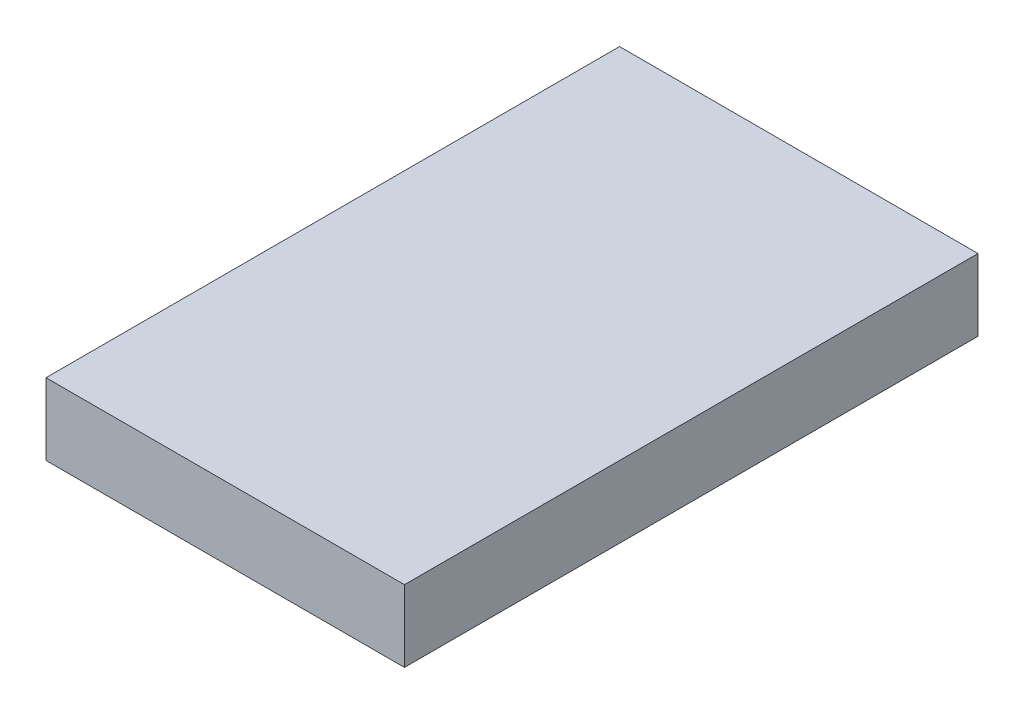
ISO-10303-21;
HEADER;
FILE_DESCRIPTION(('STEP AP214'),'2;1');
FILE_NAME('part.step','',(''),(''),'','','');
FILE_SCHEMA(('AUTOMOTIVE_DESIGN { 1 0 10303 214 1 1 1 1 }'));
ENDSEC;
DATA;
#1=APPLICATION_CONTEXT('core data for automotive mechanical design processes');
#2=APPLICATION_PROTOCOL_DEFINITION('international standard','automotive_design',2000,#1);
#3=PRODUCT_CONTEXT('',#1,'mechanical');
#4=PRODUCT('Part','Part','',(#3));
#5=PRODUCT_RELATED_PRODUCT_CATEGORY('part','',(#4));
#6=PRODUCT_DEFINITION_FORMATION('','',#4);
#7=PRODUCT_DEFINITION_CONTEXT('part definition',#1,'design');
#8=PRODUCT_DEFINITION('design','',#6,#7);
#9=PRODUCT_DEFINITION_SHAPE('','',#8);
#10=(LENGTH_UNIT() NAMED_UNIT(*) SI_UNIT(.MILLI.,.METRE.));
#11=(NAMED_UNIT(*) PLANE_ANGLE_UNIT() SI_UNIT($,.RADIAN.));
#12=(NAMED_UNIT(*) SI_UNIT($,.STERADIAN.) SOLID_ANGLE_UNIT());
#13=UNCERTAINTY_MEASURE_WITH_UNIT(LENGTH_MEASURE(1.E-05),#10,'distance_accuracy_value','');
#14=(GEOMETRIC_REPRESENTATION_CONTEXT(3) GLOBAL_UNCERTAINTY_ASSIGNED_CONTEXT((#13)) GLOBAL_UNIT_ASSIGNED_CONTEXT((#10,
#11,#12)) REPRESENTATION_CONTEXT('',''));
#15=CARTESIAN_POINT('',(0.,0.,0.));
#16=DIRECTION('',(0.,0.,1.));
#17=DIRECTION('',(1.,0.,0.));
#18=AXIS2_PLACEMENT_3D('',#15,#16,#17);
#19=CARTESIAN_POINT('',(15.,6.,-24.));
#20=DIRECTION('',(-1.,0.,0.));
#21=DIRECTION('',(0.,0.,1.));
#22=AXIS2_PLACEMENT_3D('',#19,#20,#21);
#23=PLANE('',#22);
#24=DIRECTION('',(0.,0.,-1.));
#25=VECTOR('',#24,1.);
#26=CARTESIAN_POINT('',(15.,0.,-24.));
#27=LINE('',#26,#25);
#28=CARTESIAN_POINT('',(15.,0.,24.));
#29=VERTEX_POINT('',#28);
#30=CARTESIAN_POINT('',(15.,0.,-24.));
#31=VERTEX_POINT('',#30);
#32=EDGE_CURVE('E104',#29,#31,#27,.T.);
#33=ORIENTED_EDGE('',*,*,#32,.T.);
#34=DIRECTION('',(0.,-1.,0.));
#35=VECTOR('',#34,1.);
#36=CARTESIAN_POINT('',(15.,6.,-24.));
#37=LINE('',#36,#35);
#38=CARTESIAN_POINT('',(15.,6.,-24.));
#39=VERTEX_POINT('',#38);
#40=EDGE_CURVE('E11',#39,#31,#37,.T.);
#41=ORIENTED_EDGE('',*,*,#40,.F.);
#42=DIRECTION('',(0.,0.,-1.));
#43=VECTOR('',#42,1.);
#44=CARTESIAN_POINT('',(15.,6.,-24.));
#45=LINE('',#44,#43);
#46=CARTESIAN_POINT('',(15.,6.,24.));
#47=VERTEX_POINT('',#46);
#48=EDGE_CURVE('E92',#47,#39,#45,.T.);
#49=ORIENTED_EDGE('',*,*,#48,.F.);
#50=DIRECTION('',(0.,-1.,0.));
#51=VECTOR('',#50,1.);
#52=CARTESIAN_POINT('',(15.,6.,24.));
#53=LINE('',#52,#51);
#54=EDGE_CURVE('E100',#47,#29,#53,.T.);
#55=ORIENTED_EDGE('',*,*,#54,.T.);
#56=EDGE_LOOP('',(#33,#41,#49,#55));
#57=FACE_BOUND('',#56,.T.);
#58=ADVANCED_FACE('F41',(#57),#23,.F.);
#59=CARTESIAN_POINT('',(-15.,6.,-24.));
#60=DIRECTION('',(0.,0.,1.));
#61=DIRECTION('',(1.,0.,0.));
#62=AXIS2_PLACEMENT_3D('',#59,#60,#61);
#63=PLANE('',#62);
#64=DIRECTION('',(-1.,0.,0.));
#65=VECTOR('',#64,1.);
#66=CARTESIAN_POINT('',(-15.,0.,-24.));
#67=LINE('',#66,#65);
#68=CARTESIAN_POINT('',(-15.,0.,-24.));
#69=VERTEX_POINT('',#68);
#70=EDGE_CURVE('E96',#31,#69,#67,.T.);
#71=ORIENTED_EDGE('',*,*,#70,.T.);
#72=DIRECTION('',(0.,-1.,0.));
#73=VECTOR('',#72,1.);
#74=CARTESIAN_POINT('',(-15.,6.,-24.));
#75=LINE('',#74,#73);
#76=CARTESIAN_POINT('',(-15.,6.,-24.));
#77=VERTEX_POINT('',#76);
#78=EDGE_CURVE('E49',#77,#69,#75,.T.);
#79=ORIENTED_EDGE('',*,*,#78,.F.);
#80=DIRECTION('',(-1.,0.,0.));
#81=VECTOR('',#80,1.);
#82=CARTESIAN_POINT('',(-15.,6.,-24.));
#83=LINE('',#82,#81);
#84=EDGE_CURVE('E87',#39,#77,#83,.T.);
#85=ORIENTED_EDGE('',*,*,#84,.F.);
#86=ORIENTED_EDGE('',*,*,#40,.T.);
#87=EDGE_LOOP('',(#71,#79,#85,#86));
#88=FACE_BOUND('',#87,.T.);
#89=ADVANCED_FACE('F95',(#88),#63,.F.);
#90=CARTESIAN_POINT('',(-15.,6.,-24.));
#91=DIRECTION('',(1.,0.,0.));
#92=DIRECTION('',(0.,0.,-1.));
#93=AXIS2_PLACEMENT_3D('',#90,#91,#92);
#94=PLANE('',#93);
#95=DIRECTION('',(0.,0.,1.));
#96=VECTOR('',#95,1.);
#97=CARTESIAN_POINT('',(-15.,0.,-24.));
#98=LINE('',#97,#96);
#99=CARTESIAN_POINT('',(-15.,0.,24.));
#100=VERTEX_POINT('',#99);
#101=EDGE_CURVE('E74',#69,#100,#98,.T.);
#102=ORIENTED_EDGE('',*,*,#101,.T.);
#103=DIRECTION('',(0.,-1.,0.));
#104=VECTOR('',#103,1.);
#105=CARTESIAN_POINT('',(-15.,6.,24.));
#106=LINE('',#105,#104);
#107=CARTESIAN_POINT('',(-15.,6.,24.));
#108=VERTEX_POINT('',#107);
#109=EDGE_CURVE('E97',#108,#100,#106,.T.);
#110=ORIENTED_EDGE('',*,*,#109,.F.);
#111=DIRECTION('',(0.,0.,1.));
#112=VECTOR('',#111,1.);
#113=CARTESIAN_POINT('',(-15.,6.,-24.));
#114=LINE('',#113,#112);
#115=EDGE_CURVE('E90',#77,#108,#114,.T.);
#116=ORIENTED_EDGE('',*,*,#115,.F.);
#117=ORIENTED_EDGE('',*,*,#78,.T.);
#118=EDGE_LOOP('',(#102,#110,#116,#117));
#119=FACE_BOUND('',#118,.T.);
#120=ADVANCED_FACE('F98',(#119),#94,.F.);
#121=CARTESIAN_POINT('',(-15.,6.,24.));
#122=DIRECTION('',(0.,0.,-1.));
#123=DIRECTION('',(-1.,0.,0.));
#124=AXIS2_PLACEMENT_3D('',#121,#122,#123);
#125=PLANE('',#124);
#126=DIRECTION('',(1.,0.,0.));
#127=VECTOR('',#126,1.);
#128=CARTESIAN_POINT('',(-15.,0.,24.));
#129=LINE('',#128,#127);
#130=EDGE_CURVE('E80',#100,#29,#129,.T.);
#131=ORIENTED_EDGE('',*,*,#130,.T.);
#132=ORIENTED_EDGE('',*,*,#54,.F.);
#133=DIRECTION('',(1.,0.,0.));
#134=VECTOR('',#133,1.);
#135=CARTESIAN_POINT('',(-15.,6.,24.));
#136=LINE('',#135,#134);
#137=EDGE_CURVE('E57',#108,#47,#136,.T.);
#138=ORIENTED_EDGE('',*,*,#137,.F.);
#139=ORIENTED_EDGE('',*,*,#109,.T.);
#140=EDGE_LOOP('',(#131,#132,#138,#139));
#141=FACE_BOUND('',#140,.T.);
#142=ADVANCED_FACE('F111',(#141),#125,.F.);
#143=CARTESIAN_POINT('',(0.,6.,0.));
#144=DIRECTION('',(0.,1.,0.));
#145=DIRECTION('',(0.,0.,1.));
#146=AXIS2_PLACEMENT_3D('',#143,#144,#145);
#147=PLANE('',#146);
#148=ORIENTED_EDGE('',*,*,#48,.T.);
#149=ORIENTED_EDGE('',*,*,#84,.T.);
#150=ORIENTED_EDGE('',*,*,#115,.T.);
#151=ORIENTED_EDGE('',*,*,#137,.T.);
#152=EDGE_LOOP('',(#148,#149,#150,#151));
#153=FACE_BOUND('',#152,.T.);
#154=ADVANCED_FACE('F88',(#153),#147,.T.);
#155=CARTESIAN_POINT('',(0.,0.,0.));
#156=DIRECTION('',(0.,1.,0.));
#157=DIRECTION('',(0.,0.,1.));
#158=AXIS2_PLACEMENT_3D('',#155,#156,#157);
#159=PLANE('',#158);
#160=ORIENTED_EDGE('',*,*,#32,.F.);
#161=ORIENTED_EDGE('',*,*,#130,.F.);
#162=ORIENTED_EDGE('',*,*,#101,.F.);
#163=ORIENTED_EDGE('',*,*,#70,.F.);
#164=EDGE_LOOP('',(#160,#161,#162,#163));
#165=FACE_BOUND('',#164,.T.);
#166=ADVANCED_FACE('F114',(#165),#159,.F.);
#167=CLOSED_SHELL('',(#58,#89,#120,#142,#154,#166));
#168=MANIFOLD_SOLID_BREP('B2',#167);
#169=ADVANCED_BREP_SHAPE_REPRESENTATION('',(#18,#168),#14);
#170=SHAPE_DEFINITION_REPRESENTATION(#9,#169);
ENDSEC;
END-ISO-10303-21;
